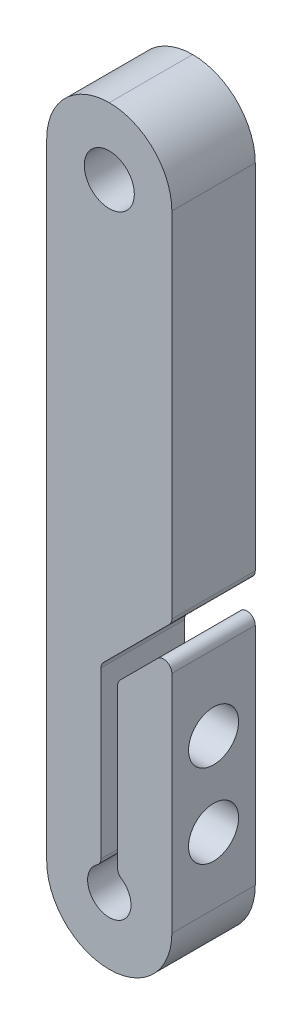
ISO-10303-21;
HEADER;
FILE_DESCRIPTION(('STEP AP214'),'2;1');
FILE_NAME('part.step','',(''),(''),'','','');
FILE_SCHEMA(('AUTOMOTIVE_DESIGN { 1 0 10303 214 1 1 1 1 }'));
ENDSEC;
DATA;
#1=APPLICATION_CONTEXT('core data for automotive mechanical design processes');
#2=APPLICATION_PROTOCOL_DEFINITION('international standard','automotive_design',2000,#1);
#3=PRODUCT_CONTEXT('',#1,'mechanical');
#4=PRODUCT('Part','Part','',(#3));
#5=PRODUCT_RELATED_PRODUCT_CATEGORY('part','',(#4));
#6=PRODUCT_DEFINITION_FORMATION('','',#4);
#7=PRODUCT_DEFINITION_CONTEXT('part definition',#1,'design');
#8=PRODUCT_DEFINITION('design','',#6,#7);
#9=PRODUCT_DEFINITION_SHAPE('','',#8);
#10=(LENGTH_UNIT() NAMED_UNIT(*) SI_UNIT(.MILLI.,.METRE.));
#11=(NAMED_UNIT(*) PLANE_ANGLE_UNIT() SI_UNIT($,.RADIAN.));
#12=(NAMED_UNIT(*) SI_UNIT($,.STERADIAN.) SOLID_ANGLE_UNIT());
#13=UNCERTAINTY_MEASURE_WITH_UNIT(LENGTH_MEASURE(1.E-05),#10,'distance_accuracy_value','');
#14=(GEOMETRIC_REPRESENTATION_CONTEXT(3) GLOBAL_UNCERTAINTY_ASSIGNED_CONTEXT((#13)) GLOBAL_UNIT_ASSIGNED_CONTEXT((#10,
#11,#12)) REPRESENTATION_CONTEXT('',''));
#15=CARTESIAN_POINT('',(0.,0.,0.));
#16=DIRECTION('',(0.,0.,1.));
#17=DIRECTION('',(1.,0.,0.));
#18=AXIS2_PLACEMENT_3D('',#15,#16,#17);
#19=CARTESIAN_POINT('',(15.,0.,10.));
#20=DIRECTION('',(-1.,0.,0.));
#21=DIRECTION('',(0.,0.,1.));
#22=AXIS2_PLACEMENT_3D('',#19,#20,#21);
#23=PLANE('',#22);
#24=DIRECTION('',(0.,1.,0.));
#25=VECTOR('',#24,1.);
#26=CARTESIAN_POINT('',(15.,0.,10.));
#27=LINE('',#26,#25);
#28=CARTESIAN_POINT('',(15.,40.1426406871192,10.));
#29=VERTEX_POINT('',#28);
#30=CARTESIAN_POINT('',(15.,82.5,10.));
#31=VERTEX_POINT('',#30);
#32=EDGE_CURVE('E193',#29,#31,#27,.T.);
#33=ORIENTED_EDGE('',*,*,#32,.F.);
#34=DIRECTION('',(0.,0.,1.));
#35=VECTOR('',#34,1.);
#36=CARTESIAN_POINT('',(15.,40.1426406871193,10.));
#37=LINE('',#36,#35);
#38=CARTESIAN_POINT('',(15.,40.1426406871192,0.));
#39=VERTEX_POINT('',#38);
#40=EDGE_CURVE('E264',#29,#39,#37,.F.);
#41=ORIENTED_EDGE('',*,*,#40,.T.);
#42=DIRECTION('',(0.,1.,0.));
#43=VECTOR('',#42,1.);
#44=CARTESIAN_POINT('',(15.,0.,0.));
#45=LINE('',#44,#43);
#46=CARTESIAN_POINT('',(15.,82.5,0.));
#47=VERTEX_POINT('',#46);
#48=EDGE_CURVE('E190',#39,#47,#45,.T.);
#49=ORIENTED_EDGE('',*,*,#48,.T.);
#50=DIRECTION('',(0.,0.,-1.));
#51=VECTOR('',#50,1.);
#52=CARTESIAN_POINT('',(15.,82.5,10.));
#53=LINE('',#52,#51);
#54=EDGE_CURVE('E181',#47,#31,#53,.F.);
#55=ORIENTED_EDGE('',*,*,#54,.T.);
#56=EDGE_LOOP('',(#33,#41,#49,#55));
#57=FACE_BOUND('',#56,.T.);
#58=ADVANCED_FACE('F33',(#57),#23,.F.);
#59=CARTESIAN_POINT('',(0.,0.,10.));
#60=DIRECTION('',(1.,0.,0.));
#61=DIRECTION('',(0.,0.,-1.));
#62=AXIS2_PLACEMENT_3D('',#59,#60,#61);
#63=PLANE('',#62);
#64=CARTESIAN_POINT('',(0.,25.5,5.));
#65=DIRECTION('',(1.,0.,0.));
#66=DIRECTION('',(0.,0.,-1.));
#67=AXIS2_PLACEMENT_3D('',#64,#65,#66);
#68=CIRCLE('',#67,2.1);
#69=CARTESIAN_POINT('',(0.,25.5,2.9));
#70=VERTEX_POINT('',#69);
#71=EDGE_CURVE('E232',#70,#70,#68,.T.);
#72=ORIENTED_EDGE('',*,*,#71,.T.);
#73=EDGE_LOOP('',(#72));
#74=FACE_BOUND('',#73,.T.);
#75=CARTESIAN_POINT('',(0.,15.5,5.));
#76=DIRECTION('',(1.,0.,0.));
#77=DIRECTION('',(0.,0.,-1.));
#78=AXIS2_PLACEMENT_3D('',#75,#76,#77);
#79=CIRCLE('',#78,2.1);
#80=CARTESIAN_POINT('',(0.,15.5,2.9));
#81=VERTEX_POINT('',#80);
#82=EDGE_CURVE('E228',#81,#81,#79,.T.);
#83=ORIENTED_EDGE('',*,*,#82,.T.);
#84=EDGE_LOOP('',(#83));
#85=FACE_BOUND('',#84,.T.);
#86=DIRECTION('',(0.,-1.,0.));
#87=VECTOR('',#86,1.);
#88=CARTESIAN_POINT('',(0.,0.,0.));
#89=LINE('',#88,#87);
#90=CARTESIAN_POINT('',(0.,82.5,0.));
#91=VERTEX_POINT('',#90);
#92=CARTESIAN_POINT('',(0.,7.5,0.));
#93=VERTEX_POINT('',#92);
#94=EDGE_CURVE('E195',#91,#93,#89,.T.);
#95=ORIENTED_EDGE('',*,*,#94,.T.);
#96=DIRECTION('',(0.,0.,-1.));
#97=VECTOR('',#96,1.);
#98=CARTESIAN_POINT('',(0.,7.5,10.));
#99=LINE('',#98,#97);
#100=CARTESIAN_POINT('',(0.,7.5,10.));
#101=VERTEX_POINT('',#100);
#102=EDGE_CURVE('E215',#93,#101,#99,.F.);
#103=ORIENTED_EDGE('',*,*,#102,.T.);
#104=DIRECTION('',(0.,-1.,0.));
#105=VECTOR('',#104,1.);
#106=CARTESIAN_POINT('',(0.,0.,10.));
#107=LINE('',#106,#105);
#108=CARTESIAN_POINT('',(0.,82.5,10.));
#109=VERTEX_POINT('',#108);
#110=EDGE_CURVE('E189',#109,#101,#107,.T.);
#111=ORIENTED_EDGE('',*,*,#110,.F.);
#112=DIRECTION('',(0.,0.,-1.));
#113=VECTOR('',#112,1.);
#114=CARTESIAN_POINT('',(0.,82.5,10.));
#115=LINE('',#114,#113);
#116=EDGE_CURVE('E213',#109,#91,#115,.T.);
#117=ORIENTED_EDGE('',*,*,#116,.T.);
#118=EDGE_LOOP('',(#95,#103,#111,#117));
#119=FACE_BOUND('',#118,.T.);
#120=ADVANCED_FACE('F340',(#74,#85,#119),#63,.F.);
#121=CARTESIAN_POINT('',(15.,15.5,5.));
#122=DIRECTION('',(1.,0.,0.));
#123=DIRECTION('',(0.,0.,-1.));
#124=AXIS2_PLACEMENT_3D('',#121,#122,#123);
#125=CIRCLE('',#124,3.);
#126=CARTESIAN_POINT('',(15.,15.5,2.));
#127=VERTEX_POINT('',#126);
#128=EDGE_CURVE('E374',#127,#127,#125,.T.);
#129=ORIENTED_EDGE('',*,*,#128,.F.);
#130=EDGE_LOOP('',(#129));
#131=FACE_BOUND('',#130,.T.);
#132=CARTESIAN_POINT('',(15.,25.5,5.));
#133=DIRECTION('',(1.,0.,0.));
#134=DIRECTION('',(0.,0.,-1.));
#135=AXIS2_PLACEMENT_3D('',#132,#133,#134);
#136=CIRCLE('',#135,3.);
#137=CARTESIAN_POINT('',(15.,25.5,2.));
#138=VERTEX_POINT('',#137);
#139=EDGE_CURVE('E377',#138,#138,#136,.T.);
#140=ORIENTED_EDGE('',*,*,#139,.F.);
#141=EDGE_LOOP('',(#140));
#142=FACE_BOUND('',#141,.T.);
#143=CARTESIAN_POINT('',(15.,7.5,0.));
#144=VERTEX_POINT('',#143);
#145=CARTESIAN_POINT('',(15.,34.4857864376269,0.));
#146=VERTEX_POINT('',#145);
#147=EDGE_CURVE('E176',#144,#146,#45,.T.);
#148=ORIENTED_EDGE('',*,*,#147,.T.);
#149=DIRECTION('',(0.,0.,1.));
#150=VECTOR('',#149,1.);
#151=CARTESIAN_POINT('',(15.,34.4857864376269,10.));
#152=LINE('',#151,#150);
#153=CARTESIAN_POINT('',(15.,34.4857864376269,10.));
#154=VERTEX_POINT('',#153);
#155=EDGE_CURVE('E271',#146,#154,#152,.T.);
#156=ORIENTED_EDGE('',*,*,#155,.T.);
#157=CARTESIAN_POINT('',(15.,7.5,10.));
#158=VERTEX_POINT('',#157);
#159=EDGE_CURVE('E179',#158,#154,#27,.T.);
#160=ORIENTED_EDGE('',*,*,#159,.F.);
#161=DIRECTION('',(0.,0.,-1.));
#162=VECTOR('',#161,1.);
#163=CARTESIAN_POINT('',(15.,7.5,10.));
#164=LINE('',#163,#162);
#165=EDGE_CURVE('E163',#158,#144,#164,.T.);
#166=ORIENTED_EDGE('',*,*,#165,.T.);
#167=EDGE_LOOP('',(#148,#156,#160,#166));
#168=FACE_BOUND('',#167,.T.);
#169=ADVANCED_FACE('F174',(#131,#142,#168),#23,.F.);
#170=CARTESIAN_POINT('',(0.,0.,10.));
#171=DIRECTION('',(0.,0.,-1.));
#172=DIRECTION('',(-1.,0.,0.));
#173=AXIS2_PLACEMENT_3D('',#170,#171,#172);
#174=PLANE('',#173);
#175=CARTESIAN_POINT('',(7.5,82.,10.));
#176=DIRECTION('',(0.,0.,1.));
#177=DIRECTION('',(1.,0.,0.));
#178=AXIS2_PLACEMENT_3D('',#175,#176,#177);
#179=CIRCLE('',#178,3.);
#180=CARTESIAN_POINT('',(10.5,82.,10.));
#181=VERTEX_POINT('',#180);
#182=EDGE_CURVE('E314',#181,#181,#179,.T.);
#183=ORIENTED_EDGE('',*,*,#182,.F.);
#184=EDGE_LOOP('',(#183));
#185=FACE_BOUND('',#184,.T.);
#186=DIRECTION('',(0.707106781186549,0.707106781186546,0.));
#187=VECTOR('',#186,1.);
#188=CARTESIAN_POINT('',(15.,36.9,10.));
#189=LINE('',#188,#187);
#190=CARTESIAN_POINT('',(8.79289321881345,30.6928932188135,10.));
#191=VERTEX_POINT('',#190);
#192=CARTESIAN_POINT('',(13.2928932188135,35.1928932188134,10.));
#193=VERTEX_POINT('',#192);
#194=EDGE_CURVE('E289',#191,#193,#189,.T.);
#195=ORIENTED_EDGE('',*,*,#194,.F.);
#196=CARTESIAN_POINT('',(9.5,29.9857864376269,10.));
#197=DIRECTION('',(0.,0.,-1.));
#198=DIRECTION('',(-1.,0.,0.));
#199=AXIS2_PLACEMENT_3D('',#196,#197,#198);
#200=CIRCLE('',#199,1.);
#201=CARTESIAN_POINT('',(8.5,29.9857864376269,10.));
#202=VERTEX_POINT('',#201);
#203=EDGE_CURVE('E245',#191,#202,#200,.F.);
#204=ORIENTED_EDGE('',*,*,#203,.T.);
#205=DIRECTION('',(0.,1.,0.));
#206=VECTOR('',#205,1.);
#207=CARTESIAN_POINT('',(8.5,30.4,10.));
#208=LINE('',#207,#206);
#209=CARTESIAN_POINT('',(8.5,10.9933259094192,10.));
#210=VERTEX_POINT('',#209);
#211=EDGE_CURVE('E227',#210,#202,#208,.T.);
#212=ORIENTED_EDGE('',*,*,#211,.F.);
#213=CARTESIAN_POINT('',(9.5,10.9933259094192,10.));
#214=DIRECTION('',(0.,0.,-1.));
#215=DIRECTION('',(-1.,0.,0.));
#216=AXIS2_PLACEMENT_3D('',#213,#214,#215);
#217=CIRCLE('',#216,1.);
#218=CARTESIAN_POINT('',(8.94444444444444,10.1618464901361,10.));
#219=VERTEX_POINT('',#218);
#220=EDGE_CURVE('E239',#210,#219,#217,.F.);
#221=ORIENTED_EDGE('',*,*,#220,.T.);
#222=CARTESIAN_POINT('',(7.5,8.,10.));
#223=DIRECTION('',(0.,0.,1.));
#224=DIRECTION('',(1.,0.,0.));
#225=AXIS2_PLACEMENT_3D('',#222,#223,#224);
#226=CIRCLE('',#225,2.6);
#227=CARTESIAN_POINT('',(6.05555555555555,10.1618464901361,10.));
#228=VERTEX_POINT('',#227);
#229=EDGE_CURVE('E219',#228,#219,#226,.T.);
#230=ORIENTED_EDGE('',*,*,#229,.F.);
#231=CARTESIAN_POINT('',(5.5,10.9933259094191,10.));
#232=DIRECTION('',(0.,0.,-1.));
#233=DIRECTION('',(-1.,0.,0.));
#234=AXIS2_PLACEMENT_3D('',#231,#232,#233);
#235=CIRCLE('',#234,1.);
#236=CARTESIAN_POINT('',(6.5,10.9933259094191,10.));
#237=VERTEX_POINT('',#236);
#238=EDGE_CURVE('E237',#228,#237,#235,.F.);
#239=ORIENTED_EDGE('',*,*,#238,.T.);
#240=DIRECTION('',(0.,-1.,0.));
#241=VECTOR('',#240,1.);
#242=CARTESIAN_POINT('',(6.5,10.4,10.));
#243=LINE('',#242,#241);
#244=CARTESIAN_POINT('',(6.5,30.8142135623731,10.));
#245=VERTEX_POINT('',#244);
#246=EDGE_CURVE('E284',#245,#237,#243,.T.);
#247=ORIENTED_EDGE('',*,*,#246,.F.);
#248=CARTESIAN_POINT('',(7.5,30.8142135623731,10.));
#249=DIRECTION('',(0.,0.,-1.));
#250=DIRECTION('',(-1.,0.,0.));
#251=AXIS2_PLACEMENT_3D('',#248,#249,#250);
#252=CIRCLE('',#251,1.);
#253=CARTESIAN_POINT('',(6.79289321881345,31.5213203435596,10.));
#254=VERTEX_POINT('',#253);
#255=EDGE_CURVE('E41',#245,#254,#252,.T.);
#256=ORIENTED_EDGE('',*,*,#255,.T.);
#257=DIRECTION('',(-0.707106781186548,-0.707106781186546,0.));
#258=VECTOR('',#257,1.);
#259=CARTESIAN_POINT('',(6.5,31.2284271247462,10.));
#260=LINE('',#259,#258);
#261=CARTESIAN_POINT('',(14.7071067811865,39.4355339059327,10.));
#262=VERTEX_POINT('',#261);
#263=EDGE_CURVE('E282',#262,#254,#260,.T.);
#264=ORIENTED_EDGE('',*,*,#263,.F.);
#265=CARTESIAN_POINT('',(14.,40.1426406871193,10.));
#266=DIRECTION('',(0.,0.,-1.));
#267=DIRECTION('',(-1.,0.,0.));
#268=AXIS2_PLACEMENT_3D('',#265,#266,#267);
#269=CIRCLE('',#268,1.);
#270=EDGE_CURVE('E243',#262,#29,#269,.F.);
#271=ORIENTED_EDGE('',*,*,#270,.T.);
#272=ORIENTED_EDGE('',*,*,#32,.T.);
#273=CARTESIAN_POINT('',(7.5,82.5,10.));
#274=DIRECTION('',(0.,0.,-1.));
#275=DIRECTION('',(-1.,0.,0.));
#276=AXIS2_PLACEMENT_3D('',#273,#274,#275);
#277=CIRCLE('',#276,7.5);
#278=CARTESIAN_POINT('',(7.5,90.,10.));
#279=VERTEX_POINT('',#278);
#280=EDGE_CURVE('E207',#31,#279,#277,.F.);
#281=ORIENTED_EDGE('',*,*,#280,.T.);
#282=CARTESIAN_POINT('',(7.5,82.5,10.));
#283=DIRECTION('',(0.,0.,-1.));
#284=DIRECTION('',(-1.,0.,0.));
#285=AXIS2_PLACEMENT_3D('',#282,#283,#284);
#286=CIRCLE('',#285,7.5);
#287=EDGE_CURVE('E168',#279,#109,#286,.F.);
#288=ORIENTED_EDGE('',*,*,#287,.T.);
#289=ORIENTED_EDGE('',*,*,#110,.T.);
#290=CARTESIAN_POINT('',(7.5,7.5,10.));
#291=DIRECTION('',(0.,0.,-1.));
#292=DIRECTION('',(-1.,0.,0.));
#293=AXIS2_PLACEMENT_3D('',#290,#291,#292);
#294=CIRCLE('',#293,7.5);
#295=CARTESIAN_POINT('',(7.5,0.,10.));
#296=VERTEX_POINT('',#295);
#297=EDGE_CURVE('E209',#101,#296,#294,.F.);
#298=ORIENTED_EDGE('',*,*,#297,.T.);
#299=CARTESIAN_POINT('',(7.5,7.5,10.));
#300=DIRECTION('',(0.,0.,-1.));
#301=DIRECTION('',(-1.,0.,0.));
#302=AXIS2_PLACEMENT_3D('',#299,#300,#301);
#303=CIRCLE('',#302,7.5);
#304=EDGE_CURVE('E211',#296,#158,#303,.F.);
#305=ORIENTED_EDGE('',*,*,#304,.T.);
#306=ORIENTED_EDGE('',*,*,#159,.T.);
#307=CARTESIAN_POINT('',(14.,34.4857864376269,10.));
#308=DIRECTION('',(0.,0.,-1.));
#309=DIRECTION('',(-1.,0.,0.));
#310=AXIS2_PLACEMENT_3D('',#307,#308,#309);
#311=CIRCLE('',#310,1.);
#312=EDGE_CURVE('E241',#154,#193,#311,.F.);
#313=ORIENTED_EDGE('',*,*,#312,.T.);
#314=EDGE_LOOP('',(#195,#204,#212,#221,#230,#239,#247,#256,#264,#271,#272,#281,#288,#289,#298,
#305,#306,#313));
#315=FACE_BOUND('',#314,.T.);
#316=ADVANCED_FACE('F281',(#185,#315),#174,.F.);
#317=CARTESIAN_POINT('',(0.,0.,0.));
#318=DIRECTION('',(0.,0.,-1.));
#319=DIRECTION('',(-1.,0.,0.));
#320=AXIS2_PLACEMENT_3D('',#317,#318,#319);
#321=PLANE('',#320);
#322=DIRECTION('',(0.,1.,0.));
#323=VECTOR('',#322,1.);
#324=CARTESIAN_POINT('',(8.5,30.4,0.));
#325=LINE('',#324,#323);
#326=CARTESIAN_POINT('',(8.5,10.9933259094192,0.));
#327=VERTEX_POINT('',#326);
#328=CARTESIAN_POINT('',(8.5,29.9857864376269,0.));
#329=VERTEX_POINT('',#328);
#330=EDGE_CURVE('E310',#327,#329,#325,.T.);
#331=ORIENTED_EDGE('',*,*,#330,.T.);
#332=CARTESIAN_POINT('',(9.5,29.9857864376269,0.));
#333=DIRECTION('',(0.,0.,-1.));
#334=DIRECTION('',(-1.,0.,0.));
#335=AXIS2_PLACEMENT_3D('',#332,#333,#334);
#336=CIRCLE('',#335,1.);
#337=CARTESIAN_POINT('',(8.79289321881345,30.6928932188135,0.));
#338=VERTEX_POINT('',#337);
#339=EDGE_CURVE('E258',#329,#338,#336,.T.);
#340=ORIENTED_EDGE('',*,*,#339,.T.);
#341=DIRECTION('',(0.707106781186549,0.707106781186546,0.));
#342=VECTOR('',#341,1.);
#343=CARTESIAN_POINT('',(15.,36.9,0.));
#344=LINE('',#343,#342);
#345=CARTESIAN_POINT('',(13.2928932188135,35.1928932188134,0.));
#346=VERTEX_POINT('',#345);
#347=EDGE_CURVE('E301',#338,#346,#344,.T.);
#348=ORIENTED_EDGE('',*,*,#347,.T.);
#349=CARTESIAN_POINT('',(14.,34.4857864376269,0.));
#350=DIRECTION('',(0.,0.,-1.));
#351=DIRECTION('',(-1.,0.,0.));
#352=AXIS2_PLACEMENT_3D('',#349,#350,#351);
#353=CIRCLE('',#352,1.);
#354=EDGE_CURVE('E188',#346,#146,#353,.T.);
#355=ORIENTED_EDGE('',*,*,#354,.T.);
#356=ORIENTED_EDGE('',*,*,#147,.F.);
#357=CARTESIAN_POINT('',(7.5,7.5,0.));
#358=DIRECTION('',(0.,0.,-1.));
#359=DIRECTION('',(-1.,0.,0.));
#360=AXIS2_PLACEMENT_3D('',#357,#358,#359);
#361=CIRCLE('',#360,7.5);
#362=CARTESIAN_POINT('',(7.5,0.,0.));
#363=VERTEX_POINT('',#362);
#364=EDGE_CURVE('E159',#144,#363,#361,.T.);
#365=ORIENTED_EDGE('',*,*,#364,.T.);
#366=CARTESIAN_POINT('',(7.5,7.5,0.));
#367=DIRECTION('',(0.,0.,-1.));
#368=DIRECTION('',(-1.,0.,0.));
#369=AXIS2_PLACEMENT_3D('',#366,#367,#368);
#370=CIRCLE('',#369,7.5);
#371=EDGE_CURVE('E169',#363,#93,#370,.T.);
#372=ORIENTED_EDGE('',*,*,#371,.T.);
#373=ORIENTED_EDGE('',*,*,#94,.F.);
#374=CARTESIAN_POINT('',(7.5,82.5,0.));
#375=DIRECTION('',(0.,0.,-1.));
#376=DIRECTION('',(-1.,0.,0.));
#377=AXIS2_PLACEMENT_3D('',#374,#375,#376);
#378=CIRCLE('',#377,7.5);
#379=CARTESIAN_POINT('',(7.5,90.,0.));
#380=VERTEX_POINT('',#379);
#381=EDGE_CURVE('E180',#91,#380,#378,.T.);
#382=ORIENTED_EDGE('',*,*,#381,.T.);
#383=CARTESIAN_POINT('',(7.5,82.5,0.));
#384=DIRECTION('',(0.,0.,-1.));
#385=DIRECTION('',(-1.,0.,0.));
#386=AXIS2_PLACEMENT_3D('',#383,#384,#385);
#387=CIRCLE('',#386,7.5);
#388=EDGE_CURVE('E202',#380,#47,#387,.T.);
#389=ORIENTED_EDGE('',*,*,#388,.T.);
#390=ORIENTED_EDGE('',*,*,#48,.F.);
#391=CARTESIAN_POINT('',(14.,40.1426406871193,0.));
#392=DIRECTION('',(0.,0.,-1.));
#393=DIRECTION('',(-1.,0.,0.));
#394=AXIS2_PLACEMENT_3D('',#391,#392,#393);
#395=CIRCLE('',#394,1.);
#396=CARTESIAN_POINT('',(14.7071067811865,39.4355339059327,0.));
#397=VERTEX_POINT('',#396);
#398=EDGE_CURVE('E55',#39,#397,#395,.T.);
#399=ORIENTED_EDGE('',*,*,#398,.T.);
#400=DIRECTION('',(-0.707106781186548,-0.707106781186546,0.));
#401=VECTOR('',#400,1.);
#402=CARTESIAN_POINT('',(6.5,31.2284271247462,0.));
#403=LINE('',#402,#401);
#404=CARTESIAN_POINT('',(6.79289321881345,31.5213203435596,0.));
#405=VERTEX_POINT('',#404);
#406=EDGE_CURVE('E296',#397,#405,#403,.T.);
#407=ORIENTED_EDGE('',*,*,#406,.T.);
#408=CARTESIAN_POINT('',(7.5,30.8142135623731,0.));
#409=DIRECTION('',(0.,0.,-1.));
#410=DIRECTION('',(-1.,0.,0.));
#411=AXIS2_PLACEMENT_3D('',#408,#409,#410);
#412=CIRCLE('',#411,1.);
#413=CARTESIAN_POINT('',(6.5,30.8142135623731,0.));
#414=VERTEX_POINT('',#413);
#415=EDGE_CURVE('E11',#405,#414,#412,.F.);
#416=ORIENTED_EDGE('',*,*,#415,.T.);
#417=DIRECTION('',(0.,-1.,0.));
#418=VECTOR('',#417,1.);
#419=CARTESIAN_POINT('',(6.5,10.4,0.));
#420=LINE('',#419,#418);
#421=CARTESIAN_POINT('',(6.5,10.9933259094191,0.));
#422=VERTEX_POINT('',#421);
#423=EDGE_CURVE('E223',#414,#422,#420,.T.);
#424=ORIENTED_EDGE('',*,*,#423,.T.);
#425=CARTESIAN_POINT('',(5.5,10.9933259094191,0.));
#426=DIRECTION('',(0.,0.,-1.));
#427=DIRECTION('',(-1.,0.,0.));
#428=AXIS2_PLACEMENT_3D('',#425,#426,#427);
#429=CIRCLE('',#428,1.);
#430=CARTESIAN_POINT('',(6.05555555555555,10.1618464901361,0.));
#431=VERTEX_POINT('',#430);
#432=EDGE_CURVE('E252',#422,#431,#429,.T.);
#433=ORIENTED_EDGE('',*,*,#432,.T.);
#434=CARTESIAN_POINT('',(7.5,8.,0.));
#435=DIRECTION('',(0.,0.,1.));
#436=DIRECTION('',(1.,0.,0.));
#437=AXIS2_PLACEMENT_3D('',#434,#435,#436);
#438=CIRCLE('',#437,2.6);
#439=CARTESIAN_POINT('',(8.94444444444444,10.1618464901361,0.));
#440=VERTEX_POINT('',#439);
#441=EDGE_CURVE('E311',#431,#440,#438,.T.);
#442=ORIENTED_EDGE('',*,*,#441,.T.);
#443=CARTESIAN_POINT('',(9.5,10.9933259094192,0.));
#444=DIRECTION('',(0.,0.,-1.));
#445=DIRECTION('',(-1.,0.,0.));
#446=AXIS2_PLACEMENT_3D('',#443,#444,#445);
#447=CIRCLE('',#446,1.);
#448=EDGE_CURVE('E254',#440,#327,#447,.T.);
#449=ORIENTED_EDGE('',*,*,#448,.T.);
#450=EDGE_LOOP('',(#331,#340,#348,#355,#356,#365,#372,#373,#382,#389,#390,#399,#407,#416,#424,
#433,#442,#449));
#451=FACE_BOUND('',#450,.T.);
#452=CARTESIAN_POINT('',(7.5,82.,0.));
#453=DIRECTION('',(0.,0.,1.));
#454=DIRECTION('',(1.,0.,0.));
#455=AXIS2_PLACEMENT_3D('',#452,#453,#454);
#456=CIRCLE('',#455,3.);
#457=CARTESIAN_POINT('',(10.5,82.,0.));
#458=VERTEX_POINT('',#457);
#459=EDGE_CURVE('E317',#458,#458,#456,.T.);
#460=ORIENTED_EDGE('',*,*,#459,.T.);
#461=EDGE_LOOP('',(#460));
#462=FACE_BOUND('',#461,.T.);
#463=ADVANCED_FACE('F184',(#451,#462),#321,.T.);
#464=CARTESIAN_POINT('',(7.5,82.,0.));
#465=DIRECTION('',(0.,0.,1.));
#466=DIRECTION('',(1.,0.,0.));
#467=AXIS2_PLACEMENT_3D('',#464,#465,#466);
#468=CYLINDRICAL_SURFACE('',#467,3.);
#469=ORIENTED_EDGE('',*,*,#459,.F.);
#470=EDGE_LOOP('',(#469));
#471=FACE_BOUND('',#470,.T.);
#472=ORIENTED_EDGE('',*,*,#182,.T.);
#473=EDGE_LOOP('',(#472));
#474=FACE_BOUND('',#473,.T.);
#475=ADVANCED_FACE('F352',(#471,#474),#468,.F.);
#476=CARTESIAN_POINT('',(7.5,8.,0.));
#477=DIRECTION('',(0.,0.,1.));
#478=DIRECTION('',(1.,0.,0.));
#479=AXIS2_PLACEMENT_3D('',#476,#477,#478);
#480=CYLINDRICAL_SURFACE('',#479,2.6);
#481=ORIENTED_EDGE('',*,*,#229,.T.);
#482=DIRECTION('',(0.,0.,1.));
#483=VECTOR('',#482,1.);
#484=CARTESIAN_POINT('',(8.94444444444444,10.1618464901361,0.));
#485=LINE('',#484,#483);
#486=EDGE_CURVE('E276',#219,#440,#485,.F.);
#487=ORIENTED_EDGE('',*,*,#486,.T.);
#488=ORIENTED_EDGE('',*,*,#441,.F.);
#489=DIRECTION('',(0.,0.,1.));
#490=VECTOR('',#489,1.);
#491=CARTESIAN_POINT('',(6.05555555555555,10.1618464901361,0.));
#492=LINE('',#491,#490);
#493=EDGE_CURVE('E273',#431,#228,#492,.T.);
#494=ORIENTED_EDGE('',*,*,#493,.T.);
#495=EDGE_LOOP('',(#481,#487,#488,#494));
#496=FACE_BOUND('',#495,.T.);
#497=ADVANCED_FACE('F345',(#496),#480,.F.);
#498=CARTESIAN_POINT('',(7.5,7.5,10.));
#499=DIRECTION('',(0.,0.,-1.));
#500=DIRECTION('',(-1.,0.,0.));
#501=AXIS2_PLACEMENT_3D('',#498,#499,#500);
#502=CYLINDRICAL_SURFACE('',#501,7.5);
#503=DIRECTION('',(0.,0.,-1.));
#504=VECTOR('',#503,1.);
#505=CARTESIAN_POINT('',(7.5,0.,10.));
#506=LINE('',#505,#504);
#507=EDGE_CURVE('E165',#296,#363,#506,.T.);
#508=ORIENTED_EDGE('',*,*,#507,.F.);
#509=ORIENTED_EDGE('',*,*,#297,.F.);
#510=ORIENTED_EDGE('',*,*,#102,.F.);
#511=ORIENTED_EDGE('',*,*,#371,.F.);
#512=EDGE_LOOP('',(#508,#509,#510,#511));
#513=FACE_BOUND('',#512,.T.);
#514=ADVANCED_FACE('F343',(#513),#502,.T.);
#515=CARTESIAN_POINT('',(7.5,7.5,10.));
#516=DIRECTION('',(0.,0.,-1.));
#517=DIRECTION('',(-1.,0.,0.));
#518=AXIS2_PLACEMENT_3D('',#515,#516,#517);
#519=CYLINDRICAL_SURFACE('',#518,7.5);
#520=ORIENTED_EDGE('',*,*,#304,.F.);
#521=ORIENTED_EDGE('',*,*,#507,.T.);
#522=ORIENTED_EDGE('',*,*,#364,.F.);
#523=ORIENTED_EDGE('',*,*,#165,.F.);
#524=EDGE_LOOP('',(#520,#521,#522,#523));
#525=FACE_BOUND('',#524,.T.);
#526=ADVANCED_FACE('F162',(#525),#519,.T.);
#527=CARTESIAN_POINT('',(7.5,82.5,10.));
#528=DIRECTION('',(0.,0.,-1.));
#529=DIRECTION('',(-1.,0.,0.));
#530=AXIS2_PLACEMENT_3D('',#527,#528,#529);
#531=CYLINDRICAL_SURFACE('',#530,7.5);
#532=ORIENTED_EDGE('',*,*,#116,.F.);
#533=ORIENTED_EDGE('',*,*,#287,.F.);
#534=DIRECTION('',(0.,0.,-1.));
#535=VECTOR('',#534,1.);
#536=CARTESIAN_POINT('',(7.5,90.,10.));
#537=LINE('',#536,#535);
#538=EDGE_CURVE('E220',#380,#279,#537,.F.);
#539=ORIENTED_EDGE('',*,*,#538,.F.);
#540=ORIENTED_EDGE('',*,*,#381,.F.);
#541=EDGE_LOOP('',(#532,#533,#539,#540));
#542=FACE_BOUND('',#541,.T.);
#543=ADVANCED_FACE('F336',(#542),#531,.T.);
#544=CARTESIAN_POINT('',(7.5,82.5,10.));
#545=DIRECTION('',(0.,0.,-1.));
#546=DIRECTION('',(-1.,0.,0.));
#547=AXIS2_PLACEMENT_3D('',#544,#545,#546);
#548=CYLINDRICAL_SURFACE('',#547,7.5);
#549=ORIENTED_EDGE('',*,*,#280,.F.);
#550=ORIENTED_EDGE('',*,*,#54,.F.);
#551=ORIENTED_EDGE('',*,*,#388,.F.);
#552=ORIENTED_EDGE('',*,*,#538,.T.);
#553=EDGE_LOOP('',(#549,#550,#551,#552));
#554=FACE_BOUND('',#553,.T.);
#555=ADVANCED_FACE('F328',(#554),#548,.T.);
#556=CARTESIAN_POINT('',(8.5,30.4,0.));
#557=DIRECTION('',(1.,0.,0.));
#558=DIRECTION('',(0.,0.,-1.));
#559=AXIS2_PLACEMENT_3D('',#556,#557,#558);
#560=PLANE('',#559);
#561=CARTESIAN_POINT('',(8.5,15.5,5.));
#562=DIRECTION('',(1.,0.,0.));
#563=DIRECTION('',(0.,0.,-1.));
#564=AXIS2_PLACEMENT_3D('',#561,#562,#563);
#565=CIRCLE('',#564,3.);
#566=CARTESIAN_POINT('',(8.49999999999999,15.5,2.));
#567=VERTEX_POINT('',#566);
#568=EDGE_CURVE('E380',#567,#567,#565,.T.);
#569=ORIENTED_EDGE('',*,*,#568,.T.);
#570=EDGE_LOOP('',(#569));
#571=FACE_BOUND('',#570,.T.);
#572=CARTESIAN_POINT('',(8.5,25.5,5.));
#573=DIRECTION('',(1.,0.,0.));
#574=DIRECTION('',(0.,0.,-1.));
#575=AXIS2_PLACEMENT_3D('',#572,#573,#574);
#576=CIRCLE('',#575,3.);
#577=CARTESIAN_POINT('',(8.49999999999999,25.5,2.));
#578=VERTEX_POINT('',#577);
#579=EDGE_CURVE('E379',#578,#578,#576,.T.);
#580=ORIENTED_EDGE('',*,*,#579,.T.);
#581=EDGE_LOOP('',(#580));
#582=FACE_BOUND('',#581,.T.);
#583=ORIENTED_EDGE('',*,*,#211,.T.);
#584=DIRECTION('',(0.,0.,1.));
#585=VECTOR('',#584,1.);
#586=CARTESIAN_POINT('',(8.5,29.9857864376269,0.));
#587=LINE('',#586,#585);
#588=EDGE_CURVE('E250',#202,#329,#587,.F.);
#589=ORIENTED_EDGE('',*,*,#588,.T.);
#590=ORIENTED_EDGE('',*,*,#330,.F.);
#591=DIRECTION('',(0.,0.,1.));
#592=VECTOR('',#591,1.);
#593=CARTESIAN_POINT('',(8.5,10.9933259094192,0.));
#594=LINE('',#593,#592);
#595=EDGE_CURVE('E247',#327,#210,#594,.T.);
#596=ORIENTED_EDGE('',*,*,#595,.T.);
#597=EDGE_LOOP('',(#583,#589,#590,#596));
#598=FACE_BOUND('',#597,.T.);
#599=ADVANCED_FACE('F405',(#571,#582,#598),#560,.F.);
#600=CARTESIAN_POINT('',(15.,36.9,0.));
#601=DIRECTION('',(0.707106781186546,-0.707106781186549,0.));
#602=DIRECTION('',(0.707106781186549,0.707106781186546,0.));
#603=AXIS2_PLACEMENT_3D('',#600,#601,#602);
#604=PLANE('',#603);
#605=ORIENTED_EDGE('',*,*,#347,.F.);
#606=DIRECTION('',(0.,0.,1.));
#607=VECTOR('',#606,1.);
#608=CARTESIAN_POINT('',(8.79289321881345,30.6928932188135,0.));
#609=LINE('',#608,#607);
#610=EDGE_CURVE('E234',#338,#191,#609,.T.);
#611=ORIENTED_EDGE('',*,*,#610,.T.);
#612=ORIENTED_EDGE('',*,*,#194,.T.);
#613=DIRECTION('',(0.,0.,1.));
#614=VECTOR('',#613,1.);
#615=CARTESIAN_POINT('',(13.2928932188135,35.1928932188134,0.));
#616=LINE('',#615,#614);
#617=EDGE_CURVE('E217',#193,#346,#616,.F.);
#618=ORIENTED_EDGE('',*,*,#617,.T.);
#619=EDGE_LOOP('',(#605,#611,#612,#618));
#620=FACE_BOUND('',#619,.T.);
#621=ADVANCED_FACE('F399',(#620),#604,.F.);
#622=CARTESIAN_POINT('',(6.5,10.4,0.));
#623=DIRECTION('',(-1.,0.,0.));
#624=DIRECTION('',(0.,0.,1.));
#625=AXIS2_PLACEMENT_3D('',#622,#623,#624);
#626=PLANE('',#625);
#627=CARTESIAN_POINT('',(6.5,25.5,5.));
#628=DIRECTION('',(-1.,0.,0.));
#629=DIRECTION('',(0.,0.,1.));
#630=AXIS2_PLACEMENT_3D('',#627,#628,#629);
#631=CIRCLE('',#630,2.1);
#632=CARTESIAN_POINT('',(6.5,25.5,7.1));
#633=VERTEX_POINT('',#632);
#634=EDGE_CURVE('E229',#633,#633,#631,.T.);
#635=ORIENTED_EDGE('',*,*,#634,.T.);
#636=EDGE_LOOP('',(#635));
#637=FACE_BOUND('',#636,.T.);
#638=CARTESIAN_POINT('',(6.5,15.5,5.));
#639=DIRECTION('',(-1.,0.,0.));
#640=DIRECTION('',(0.,0.,1.));
#641=AXIS2_PLACEMENT_3D('',#638,#639,#640);
#642=CIRCLE('',#641,2.1);
#643=CARTESIAN_POINT('',(6.5,15.5,7.1));
#644=VERTEX_POINT('',#643);
#645=EDGE_CURVE('E224',#644,#644,#642,.T.);
#646=ORIENTED_EDGE('',*,*,#645,.T.);
#647=EDGE_LOOP('',(#646));
#648=FACE_BOUND('',#647,.T.);
#649=ORIENTED_EDGE('',*,*,#423,.F.);
#650=DIRECTION('',(0.,0.,1.));
#651=VECTOR('',#650,1.);
#652=CARTESIAN_POINT('',(6.5,30.8142135623731,10.));
#653=LINE('',#652,#651);
#654=EDGE_CURVE('E268',#414,#245,#653,.T.);
#655=ORIENTED_EDGE('',*,*,#654,.T.);
#656=ORIENTED_EDGE('',*,*,#246,.T.);
#657=DIRECTION('',(0.,0.,1.));
#658=VECTOR('',#657,1.);
#659=CARTESIAN_POINT('',(6.5,10.9933259094191,0.));
#660=LINE('',#659,#658);
#661=EDGE_CURVE('E266',#237,#422,#660,.F.);
#662=ORIENTED_EDGE('',*,*,#661,.T.);
#663=EDGE_LOOP('',(#649,#655,#656,#662));
#664=FACE_BOUND('',#663,.T.);
#665=ADVANCED_FACE('F298',(#637,#648,#664),#626,.F.);
#666=CARTESIAN_POINT('',(6.5,31.2284271247462,0.));
#667=DIRECTION('',(-0.707106781186546,0.707106781186548,0.));
#668=DIRECTION('',(-0.707106781186549,-0.707106781186547,0.));
#669=AXIS2_PLACEMENT_3D('',#666,#667,#668);
#670=PLANE('',#669);
#671=ORIENTED_EDGE('',*,*,#406,.F.);
#672=DIRECTION('',(0.,0.,1.));
#673=VECTOR('',#672,1.);
#674=CARTESIAN_POINT('',(14.7071067811865,39.4355339059327,0.));
#675=LINE('',#674,#673);
#676=EDGE_CURVE('E261',#397,#262,#675,.T.);
#677=ORIENTED_EDGE('',*,*,#676,.T.);
#678=ORIENTED_EDGE('',*,*,#263,.T.);
#679=DIRECTION('',(0.,0.,1.));
#680=VECTOR('',#679,1.);
#681=CARTESIAN_POINT('',(6.79289321881345,31.5213203435596,0.));
#682=LINE('',#681,#680);
#683=EDGE_CURVE('E48',#254,#405,#682,.F.);
#684=ORIENTED_EDGE('',*,*,#683,.T.);
#685=EDGE_LOOP('',(#671,#677,#678,#684));
#686=FACE_BOUND('',#685,.T.);
#687=ADVANCED_FACE('F287',(#686),#670,.F.);
#688=CARTESIAN_POINT('',(0.,15.5,5.));
#689=DIRECTION('',(1.,0.,0.));
#690=DIRECTION('',(0.,0.,-1.));
#691=AXIS2_PLACEMENT_3D('',#688,#689,#690);
#692=CYLINDRICAL_SURFACE('',#691,2.1);
#693=ORIENTED_EDGE('',*,*,#82,.F.);
#694=EDGE_LOOP('',(#693));
#695=FACE_BOUND('',#694,.T.);
#696=ORIENTED_EDGE('',*,*,#645,.F.);
#697=EDGE_LOOP('',(#696));
#698=FACE_BOUND('',#697,.T.);
#699=ADVANCED_FACE('F493',(#695,#698),#692,.F.);
#700=CARTESIAN_POINT('',(0.,25.5,5.));
#701=DIRECTION('',(1.,0.,0.));
#702=DIRECTION('',(0.,0.,-1.));
#703=AXIS2_PLACEMENT_3D('',#700,#701,#702);
#704=CYLINDRICAL_SURFACE('',#703,2.1);
#705=ORIENTED_EDGE('',*,*,#71,.F.);
#706=EDGE_LOOP('',(#705));
#707=FACE_BOUND('',#706,.T.);
#708=ORIENTED_EDGE('',*,*,#634,.F.);
#709=EDGE_LOOP('',(#708));
#710=FACE_BOUND('',#709,.T.);
#711=ADVANCED_FACE('F542',(#707,#710),#704,.F.);
#712=CARTESIAN_POINT('',(8.5,25.5,5.));
#713=DIRECTION('',(1.,0.,0.));
#714=DIRECTION('',(0.,0.,-1.));
#715=AXIS2_PLACEMENT_3D('',#712,#713,#714);
#716=CYLINDRICAL_SURFACE('',#715,3.);
#717=CARTESIAN_POINT('',(8.49999999999999,25.5,2.));
#718=CARTESIAN_POINT('',(8.56770833333333,25.5,2.));
#719=CARTESIAN_POINT('',(8.63541666666666,25.5,2.));
#720=CARTESIAN_POINT('',(8.77083333333333,25.5,2.));
#721=CARTESIAN_POINT('',(8.83854166666666,25.5,2.));
#722=CARTESIAN_POINT('',(8.97395833333333,25.5,2.));
#723=CARTESIAN_POINT('',(9.04166666666666,25.5,2.));
#724=CARTESIAN_POINT('',(9.17708333333333,25.5,2.));
#725=CARTESIAN_POINT('',(9.24479166666666,25.5,2.));
#726=CARTESIAN_POINT('',(9.38020833333333,25.5,2.));
#727=CARTESIAN_POINT('',(9.44791666666666,25.5,2.));
#728=CARTESIAN_POINT('',(9.58333333333333,25.5,2.));
#729=CARTESIAN_POINT('',(9.65104166666666,25.5,2.));
#730=CARTESIAN_POINT('',(9.78645833333333,25.5,2.));
#731=CARTESIAN_POINT('',(9.85416666666666,25.5,2.));
#732=CARTESIAN_POINT('',(9.98958333333333,25.5,2.));
#733=CARTESIAN_POINT('',(10.0572916666667,25.5,2.));
#734=CARTESIAN_POINT('',(10.1927083333333,25.5,2.));
#735=CARTESIAN_POINT('',(10.2604166666667,25.5,2.));
#736=CARTESIAN_POINT('',(10.3958333333333,25.5,2.));
#737=CARTESIAN_POINT('',(10.4635416666667,25.5,2.));
#738=CARTESIAN_POINT('',(10.5989583333333,25.5,2.));
#739=CARTESIAN_POINT('',(10.6666666666667,25.5,2.));
#740=CARTESIAN_POINT('',(10.8020833333333,25.5,2.));
#741=CARTESIAN_POINT('',(10.8697916666667,25.5,2.));
#742=CARTESIAN_POINT('',(11.0052083333333,25.5,2.));
#743=CARTESIAN_POINT('',(11.0729166666667,25.5,2.));
#744=CARTESIAN_POINT('',(11.2083333333333,25.5,2.));
#745=CARTESIAN_POINT('',(11.2760416666667,25.5,2.));
#746=CARTESIAN_POINT('',(11.4114583333333,25.5,2.));
#747=CARTESIAN_POINT('',(11.4791666666667,25.5,2.));
#748=CARTESIAN_POINT('',(11.6145833333333,25.5,2.));
#749=CARTESIAN_POINT('',(11.6822916666667,25.5,2.));
#750=CARTESIAN_POINT('',(11.8177083333333,25.5,2.));
#751=CARTESIAN_POINT('',(11.8854166666667,25.5,2.));
#752=CARTESIAN_POINT('',(12.0208333333333,25.5,2.));
#753=CARTESIAN_POINT('',(12.0885416666667,25.5,2.));
#754=CARTESIAN_POINT('',(12.2239583333333,25.5,2.));
#755=CARTESIAN_POINT('',(12.2916666666667,25.5,2.));
#756=CARTESIAN_POINT('',(12.4270833333333,25.5,2.));
#757=CARTESIAN_POINT('',(12.4947916666667,25.5,2.));
#758=CARTESIAN_POINT('',(12.6302083333333,25.5,2.));
#759=CARTESIAN_POINT('',(12.6979166666667,25.5,2.));
#760=CARTESIAN_POINT('',(12.8333333333333,25.5,2.));
#761=CARTESIAN_POINT('',(12.9010416666667,25.5,2.));
#762=CARTESIAN_POINT('',(13.0364583333333,25.5,2.));
#763=CARTESIAN_POINT('',(13.1041666666667,25.5,2.));
#764=CARTESIAN_POINT('',(13.2395833333333,25.5,2.));
#765=CARTESIAN_POINT('',(13.3072916666667,25.5,2.));
#766=CARTESIAN_POINT('',(13.4427083333333,25.5,2.));
#767=CARTESIAN_POINT('',(13.5104166666667,25.5,2.));
#768=CARTESIAN_POINT('',(13.6458333333333,25.5,2.));
#769=CARTESIAN_POINT('',(13.7135416666667,25.5,2.));
#770=CARTESIAN_POINT('',(13.8489583333333,25.5,2.));
#771=CARTESIAN_POINT('',(13.9166666666667,25.5,2.));
#772=CARTESIAN_POINT('',(14.0520833333333,25.5,2.));
#773=CARTESIAN_POINT('',(14.1197916666667,25.5,2.));
#774=CARTESIAN_POINT('',(14.2552083333333,25.5,2.));
#775=CARTESIAN_POINT('',(14.3229166666667,25.5,2.));
#776=CARTESIAN_POINT('',(14.4583333333333,25.5,2.));
#777=CARTESIAN_POINT('',(14.5260416666667,25.5,2.));
#778=CARTESIAN_POINT('',(14.6614583333333,25.5,2.));
#779=CARTESIAN_POINT('',(14.7291666666667,25.5,2.));
#780=CARTESIAN_POINT('',(14.8645833333333,25.5,2.));
#781=CARTESIAN_POINT('',(14.9322916666667,25.5,2.));
#782=CARTESIAN_POINT('',(15.,25.5,2.));
#783=B_SPLINE_CURVE_WITH_KNOTS('',3,(#717,#718,#719,#720,#721,#722,#723,#724,#725,#726,#727,
#728,#729,#730,#731,#732,#733,#734,#735,#736,#737,#738,#739,#740,#741,#742,#743,#744,#745,#746,
#747,#748,#749,#750,#751,#752,#753,#754,#755,#756,#757,#758,#759,#760,#761,#762,#763,#764,#765,
#766,#767,#768,#769,#770,#771,#772,#773,#774,#775,#776,#777,#778,#779,#780,#781,#782),
.UNSPECIFIED.,.F.,.F.,(4,2,2,2,2,2,2,2,2,2,2,2,2,2,2,2,2,2,2,2,2,2,2,2,2,2,2,2,2,2,2,2,4),(0.,
0.203125,0.40625,0.609375000000001,0.812500000000001,1.015625,1.21875,1.421875,1.625,1.828125,
2.03125,2.234375,2.4375,2.640625,2.84375,3.046875,3.25,3.453125,3.65625,3.859375,4.0625,
4.265625,4.46875,4.671875,4.875,5.078125,5.28125,5.484375,5.6875,5.890625,6.09375,6.296875,6.5),.UNSPECIFIED.);
#784=EDGE_CURVE('BSEAM535',#578,#138,#783,.T.);
#785=ORIENTED_EDGE('',*,*,#579,.F.);
#786=ORIENTED_EDGE('',*,*,#139,.T.);
#787=ORIENTED_EDGE('',*,*,#784,.T.);
#788=ORIENTED_EDGE('',*,*,#784,.F.);
#789=EDGE_LOOP('',(#785,#787,#786,#788));
#790=FACE_BOUND('',#789,.T.);
#791=ADVANCED_FACE('F535',(#790),#716,.F.);
#792=CARTESIAN_POINT('',(8.5,15.5,5.));
#793=DIRECTION('',(1.,0.,0.));
#794=DIRECTION('',(0.,0.,-1.));
#795=AXIS2_PLACEMENT_3D('',#792,#793,#794);
#796=CYLINDRICAL_SURFACE('',#795,3.);
#797=CARTESIAN_POINT('',(8.49999999999999,15.5,2.));
#798=CARTESIAN_POINT('',(8.56770833333333,15.5,2.));
#799=CARTESIAN_POINT('',(8.63541666666666,15.5,2.));
#800=CARTESIAN_POINT('',(8.77083333333333,15.5,2.));
#801=CARTESIAN_POINT('',(8.83854166666666,15.5,2.));
#802=CARTESIAN_POINT('',(8.97395833333333,15.5,2.));
#803=CARTESIAN_POINT('',(9.04166666666666,15.5,2.));
#804=CARTESIAN_POINT('',(9.17708333333333,15.5,2.));
#805=CARTESIAN_POINT('',(9.24479166666666,15.5,2.));
#806=CARTESIAN_POINT('',(9.38020833333333,15.5,2.));
#807=CARTESIAN_POINT('',(9.44791666666666,15.5,2.));
#808=CARTESIAN_POINT('',(9.58333333333333,15.5,2.));
#809=CARTESIAN_POINT('',(9.65104166666666,15.5,2.));
#810=CARTESIAN_POINT('',(9.78645833333333,15.5,2.));
#811=CARTESIAN_POINT('',(9.85416666666666,15.5,2.));
#812=CARTESIAN_POINT('',(9.98958333333333,15.5,2.));
#813=CARTESIAN_POINT('',(10.0572916666667,15.5,2.));
#814=CARTESIAN_POINT('',(10.1927083333333,15.5,2.));
#815=CARTESIAN_POINT('',(10.2604166666667,15.5,2.));
#816=CARTESIAN_POINT('',(10.3958333333333,15.5,2.));
#817=CARTESIAN_POINT('',(10.4635416666667,15.5,2.));
#818=CARTESIAN_POINT('',(10.5989583333333,15.5,2.));
#819=CARTESIAN_POINT('',(10.6666666666667,15.5,2.));
#820=CARTESIAN_POINT('',(10.8020833333333,15.5,2.));
#821=CARTESIAN_POINT('',(10.8697916666667,15.5,2.));
#822=CARTESIAN_POINT('',(11.0052083333333,15.5,2.));
#823=CARTESIAN_POINT('',(11.0729166666667,15.5,2.));
#824=CARTESIAN_POINT('',(11.2083333333333,15.5,2.));
#825=CARTESIAN_POINT('',(11.2760416666667,15.5,2.));
#826=CARTESIAN_POINT('',(11.4114583333333,15.5,2.));
#827=CARTESIAN_POINT('',(11.4791666666667,15.5,2.));
#828=CARTESIAN_POINT('',(11.6145833333333,15.5,2.));
#829=CARTESIAN_POINT('',(11.6822916666667,15.5,2.));
#830=CARTESIAN_POINT('',(11.8177083333333,15.5,2.));
#831=CARTESIAN_POINT('',(11.8854166666667,15.5,2.));
#832=CARTESIAN_POINT('',(12.0208333333333,15.5,2.));
#833=CARTESIAN_POINT('',(12.0885416666667,15.5,2.));
#834=CARTESIAN_POINT('',(12.2239583333333,15.5,2.));
#835=CARTESIAN_POINT('',(12.2916666666667,15.5,2.));
#836=CARTESIAN_POINT('',(12.4270833333333,15.5,2.));
#837=CARTESIAN_POINT('',(12.4947916666667,15.5,2.));
#838=CARTESIAN_POINT('',(12.6302083333333,15.5,2.));
#839=CARTESIAN_POINT('',(12.6979166666667,15.5,2.));
#840=CARTESIAN_POINT('',(12.8333333333333,15.5,2.));
#841=CARTESIAN_POINT('',(12.9010416666667,15.5,2.));
#842=CARTESIAN_POINT('',(13.0364583333333,15.5,2.));
#843=CARTESIAN_POINT('',(13.1041666666667,15.5,2.));
#844=CARTESIAN_POINT('',(13.2395833333333,15.5,2.));
#845=CARTESIAN_POINT('',(13.3072916666667,15.5,2.));
#846=CARTESIAN_POINT('',(13.4427083333333,15.5,2.));
#847=CARTESIAN_POINT('',(13.5104166666667,15.5,2.));
#848=CARTESIAN_POINT('',(13.6458333333333,15.5,2.));
#849=CARTESIAN_POINT('',(13.7135416666667,15.5,2.));
#850=CARTESIAN_POINT('',(13.8489583333333,15.5,2.));
#851=CARTESIAN_POINT('',(13.9166666666667,15.5,2.));
#852=CARTESIAN_POINT('',(14.0520833333333,15.5,2.));
#853=CARTESIAN_POINT('',(14.1197916666667,15.5,2.));
#854=CARTESIAN_POINT('',(14.2552083333333,15.5,2.));
#855=CARTESIAN_POINT('',(14.3229166666667,15.5,2.));
#856=CARTESIAN_POINT('',(14.4583333333333,15.5,2.));
#857=CARTESIAN_POINT('',(14.5260416666667,15.5,2.));
#858=CARTESIAN_POINT('',(14.6614583333333,15.5,2.));
#859=CARTESIAN_POINT('',(14.7291666666667,15.5,2.));
#860=CARTESIAN_POINT('',(14.8645833333333,15.5,2.));
#861=CARTESIAN_POINT('',(14.9322916666667,15.5,2.));
#862=CARTESIAN_POINT('',(15.,15.5,2.));
#863=B_SPLINE_CURVE_WITH_KNOTS('',3,(#797,#798,#799,#800,#801,#802,#803,#804,#805,#806,#807,
#808,#809,#810,#811,#812,#813,#814,#815,#816,#817,#818,#819,#820,#821,#822,#823,#824,#825,#826,
#827,#828,#829,#830,#831,#832,#833,#834,#835,#836,#837,#838,#839,#840,#841,#842,#843,#844,#845,
#846,#847,#848,#849,#850,#851,#852,#853,#854,#855,#856,#857,#858,#859,#860,#861,#862),
.UNSPECIFIED.,.F.,.F.,(4,2,2,2,2,2,2,2,2,2,2,2,2,2,2,2,2,2,2,2,2,2,2,2,2,2,2,2,2,2,2,2,4),(0.,
0.203125,0.40625,0.609375000000001,0.812500000000001,1.015625,1.21875,1.421875,1.625,1.828125,
2.03125,2.234375,2.4375,2.640625,2.84375,3.046875,3.25,3.453125,3.65625,3.859375,4.0625,
4.265625,4.46875,4.671875,4.875,5.078125,5.28125,5.484375,5.6875,5.890625,6.09375,6.296875,6.5),.UNSPECIFIED.);
#864=EDGE_CURVE('BSEAM433',#567,#127,#863,.T.);
#865=ORIENTED_EDGE('',*,*,#568,.F.);
#866=ORIENTED_EDGE('',*,*,#128,.T.);
#867=ORIENTED_EDGE('',*,*,#864,.T.);
#868=ORIENTED_EDGE('',*,*,#864,.F.);
#869=EDGE_LOOP('',(#865,#867,#866,#868));
#870=FACE_BOUND('',#869,.T.);
#871=ADVANCED_FACE('F433',(#870),#796,.F.);
#872=CARTESIAN_POINT('',(9.5,29.9857864376269,0.));
#873=DIRECTION('',(0.,0.,1.));
#874=DIRECTION('',(1.,0.,0.));
#875=AXIS2_PLACEMENT_3D('',#872,#873,#874);
#876=CYLINDRICAL_SURFACE('',#875,1.);
#877=ORIENTED_EDGE('',*,*,#339,.F.);
#878=ORIENTED_EDGE('',*,*,#588,.F.);
#879=ORIENTED_EDGE('',*,*,#203,.F.);
#880=ORIENTED_EDGE('',*,*,#610,.F.);
#881=EDGE_LOOP('',(#877,#878,#879,#880));
#882=FACE_BOUND('',#881,.T.);
#883=ADVANCED_FACE('F401',(#882),#876,.T.);
#884=CARTESIAN_POINT('',(14.,40.1426406871193,0.));
#885=DIRECTION('',(0.,0.,1.));
#886=DIRECTION('',(1.,0.,0.));
#887=AXIS2_PLACEMENT_3D('',#884,#885,#886);
#888=CYLINDRICAL_SURFACE('',#887,1.);
#889=ORIENTED_EDGE('',*,*,#398,.F.);
#890=ORIENTED_EDGE('',*,*,#40,.F.);
#891=ORIENTED_EDGE('',*,*,#270,.F.);
#892=ORIENTED_EDGE('',*,*,#676,.F.);
#893=EDGE_LOOP('',(#889,#890,#891,#892));
#894=FACE_BOUND('',#893,.T.);
#895=ADVANCED_FACE('F427',(#894),#888,.T.);
#896=CARTESIAN_POINT('',(7.5,30.8142135623731,0.));
#897=DIRECTION('',(0.,0.,-1.));
#898=DIRECTION('',(-1.,0.,0.));
#899=AXIS2_PLACEMENT_3D('',#896,#897,#898);
#900=CYLINDRICAL_SURFACE('',#899,1.);
#901=ORIENTED_EDGE('',*,*,#415,.F.);
#902=ORIENTED_EDGE('',*,*,#683,.F.);
#903=ORIENTED_EDGE('',*,*,#255,.F.);
#904=ORIENTED_EDGE('',*,*,#654,.F.);
#905=EDGE_LOOP('',(#901,#902,#903,#904));
#906=FACE_BOUND('',#905,.T.);
#907=ADVANCED_FACE('F292',(#906),#900,.F.);
#908=CARTESIAN_POINT('',(14.,34.4857864376269,10.));
#909=DIRECTION('',(0.,0.,1.));
#910=DIRECTION('',(1.,0.,0.));
#911=AXIS2_PLACEMENT_3D('',#908,#909,#910);
#912=CYLINDRICAL_SURFACE('',#911,1.);
#913=ORIENTED_EDGE('',*,*,#354,.F.);
#914=ORIENTED_EDGE('',*,*,#617,.F.);
#915=ORIENTED_EDGE('',*,*,#312,.F.);
#916=ORIENTED_EDGE('',*,*,#155,.F.);
#917=EDGE_LOOP('',(#913,#914,#915,#916));
#918=FACE_BOUND('',#917,.T.);
#919=ADVANCED_FACE('F398',(#918),#912,.T.);
#920=CARTESIAN_POINT('',(9.5,10.9933259094192,0.));
#921=DIRECTION('',(0.,0.,1.));
#922=DIRECTION('',(1.,0.,0.));
#923=AXIS2_PLACEMENT_3D('',#920,#921,#922);
#924=CYLINDRICAL_SURFACE('',#923,1.);
#925=ORIENTED_EDGE('',*,*,#448,.F.);
#926=ORIENTED_EDGE('',*,*,#486,.F.);
#927=ORIENTED_EDGE('',*,*,#220,.F.);
#928=ORIENTED_EDGE('',*,*,#595,.F.);
#929=EDGE_LOOP('',(#925,#926,#927,#928));
#930=FACE_BOUND('',#929,.T.);
#931=ADVANCED_FACE('F410',(#930),#924,.T.);
#932=CARTESIAN_POINT('',(5.5,10.9933259094191,0.));
#933=DIRECTION('',(0.,0.,1.));
#934=DIRECTION('',(1.,0.,0.));
#935=AXIS2_PLACEMENT_3D('',#932,#933,#934);
#936=CYLINDRICAL_SURFACE('',#935,1.);
#937=ORIENTED_EDGE('',*,*,#432,.F.);
#938=ORIENTED_EDGE('',*,*,#661,.F.);
#939=ORIENTED_EDGE('',*,*,#238,.F.);
#940=ORIENTED_EDGE('',*,*,#493,.F.);
#941=EDGE_LOOP('',(#937,#938,#939,#940));
#942=FACE_BOUND('',#941,.T.);
#943=ADVANCED_FACE('F35',(#942),#936,.T.);
#944=CLOSED_SHELL('',(#58,#120,#169,#316,#463,#475,#497,#514,#526,#543,#555,#599,#621,#665,#687,
#699,#711,#791,#871,#883,#895,#907,#919,#931,#943));
#945=MANIFOLD_SOLID_BREP('B2',#944);
#946=ADVANCED_BREP_SHAPE_REPRESENTATION('',(#18,#945),#14);
#947=SHAPE_DEFINITION_REPRESENTATION(#9,#946);
ENDSEC;
END-ISO-10303-21;
